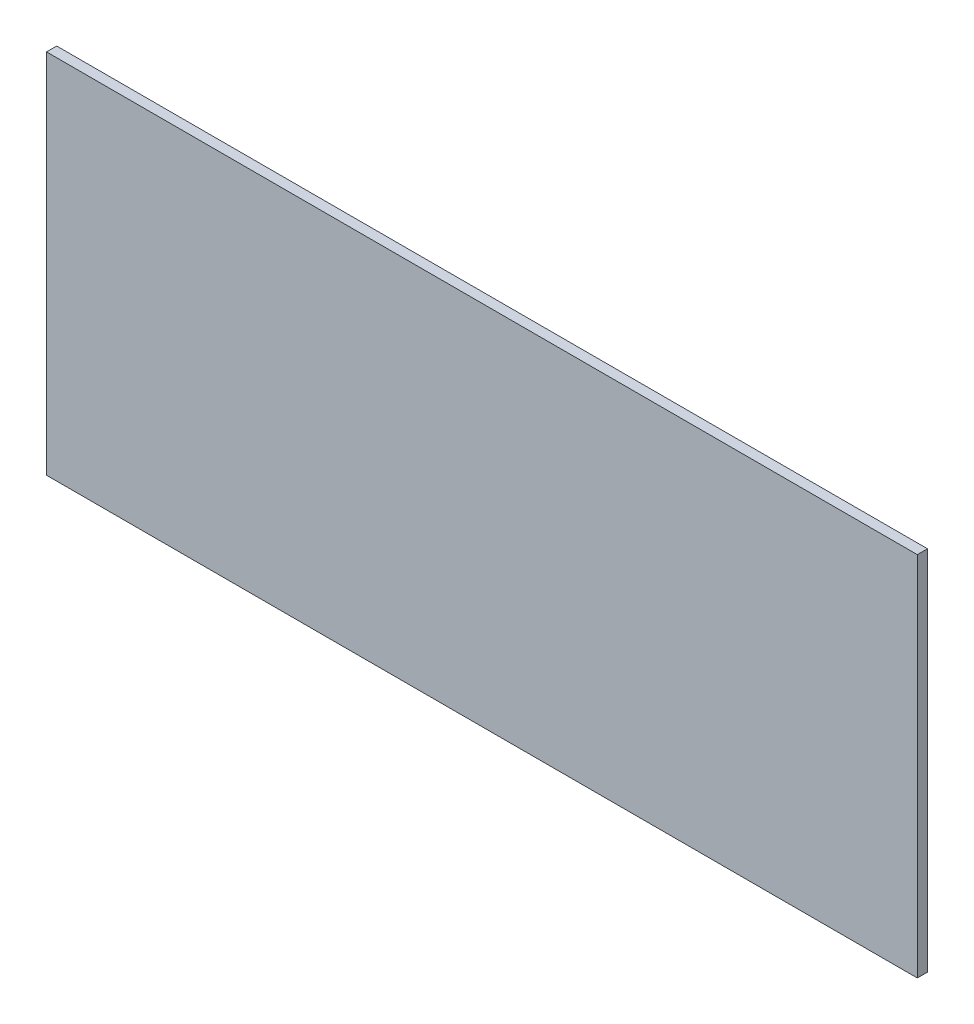
ISO-10303-21;
HEADER;
FILE_DESCRIPTION(('STEP AP214'),'2;1');
FILE_NAME('part.step','',(''),(''),'','','');
FILE_SCHEMA(('AUTOMOTIVE_DESIGN { 1 0 10303 214 1 1 1 1 }'));
ENDSEC;
DATA;
#1=APPLICATION_CONTEXT('core data for automotive mechanical design processes');
#2=APPLICATION_PROTOCOL_DEFINITION('international standard','automotive_design',2000,#1);
#3=PRODUCT_CONTEXT('',#1,'mechanical');
#4=PRODUCT('Part','Part','',(#3));
#5=PRODUCT_RELATED_PRODUCT_CATEGORY('part','',(#4));
#6=PRODUCT_DEFINITION_FORMATION('','',#4);
#7=PRODUCT_DEFINITION_CONTEXT('part definition',#1,'design');
#8=PRODUCT_DEFINITION('design','',#6,#7);
#9=PRODUCT_DEFINITION_SHAPE('','',#8);
#10=(LENGTH_UNIT() NAMED_UNIT(*) SI_UNIT(.MILLI.,.METRE.));
#11=(NAMED_UNIT(*) PLANE_ANGLE_UNIT() SI_UNIT($,.RADIAN.));
#12=(NAMED_UNIT(*) SI_UNIT($,.STERADIAN.) SOLID_ANGLE_UNIT());
#13=UNCERTAINTY_MEASURE_WITH_UNIT(LENGTH_MEASURE(1.E-05),#10,'distance_accuracy_value','');
#14=(GEOMETRIC_REPRESENTATION_CONTEXT(3) GLOBAL_UNCERTAINTY_ASSIGNED_CONTEXT((#13)) GLOBAL_UNIT_ASSIGNED_CONTEXT((#10,
#11,#12)) REPRESENTATION_CONTEXT('',''));
#15=CARTESIAN_POINT('',(0.,0.,0.));
#16=DIRECTION('',(0.,0.,1.));
#17=DIRECTION('',(1.,0.,0.));
#18=AXIS2_PLACEMENT_3D('',#15,#16,#17);
#19=CARTESIAN_POINT('',(87.,-36.,2.));
#20=DIRECTION('',(-1.,0.,0.));
#21=DIRECTION('',(0.,0.,1.));
#22=AXIS2_PLACEMENT_3D('',#19,#20,#21);
#23=PLANE('',#22);
#24=DIRECTION('',(0.,1.,0.));
#25=VECTOR('',#24,1.);
#26=CARTESIAN_POINT('',(87.,-36.,0.));
#27=LINE('',#26,#25);
#28=CARTESIAN_POINT('',(87.,-36.,0.));
#29=VERTEX_POINT('',#28);
#30=CARTESIAN_POINT('',(87.,36.,0.));
#31=VERTEX_POINT('',#30);
#32=EDGE_CURVE('E96',#29,#31,#27,.T.);
#33=ORIENTED_EDGE('',*,*,#32,.T.);
#34=DIRECTION('',(0.,0.,-1.));
#35=VECTOR('',#34,1.);
#36=CARTESIAN_POINT('',(87.,36.,2.));
#37=LINE('',#36,#35);
#38=CARTESIAN_POINT('',(87.,36.,2.));
#39=VERTEX_POINT('',#38);
#40=EDGE_CURVE('E11',#39,#31,#37,.T.);
#41=ORIENTED_EDGE('',*,*,#40,.F.);
#42=DIRECTION('',(0.,1.,0.));
#43=VECTOR('',#42,1.);
#44=CARTESIAN_POINT('',(87.,-36.,2.));
#45=LINE('',#44,#43);
#46=CARTESIAN_POINT('',(87.,-36.,2.));
#47=VERTEX_POINT('',#46);
#48=EDGE_CURVE('E84',#47,#39,#45,.T.);
#49=ORIENTED_EDGE('',*,*,#48,.F.);
#50=DIRECTION('',(0.,0.,-1.));
#51=VECTOR('',#50,1.);
#52=CARTESIAN_POINT('',(87.,-36.,2.));
#53=LINE('',#52,#51);
#54=EDGE_CURVE('E92',#47,#29,#53,.T.);
#55=ORIENTED_EDGE('',*,*,#54,.T.);
#56=EDGE_LOOP('',(#33,#41,#49,#55));
#57=FACE_BOUND('',#56,.T.);
#58=ADVANCED_FACE('F33',(#57),#23,.F.);
#59=CARTESIAN_POINT('',(-84.,36.,2.));
#60=DIRECTION('',(0.,-1.,0.));
#61=DIRECTION('',(0.,0.,-1.));
#62=AXIS2_PLACEMENT_3D('',#59,#60,#61);
#63=PLANE('',#62);
#64=DIRECTION('',(-1.,0.,0.));
#65=VECTOR('',#64,1.);
#66=CARTESIAN_POINT('',(-84.,36.,0.));
#67=LINE('',#66,#65);
#68=CARTESIAN_POINT('',(-84.,36.,0.));
#69=VERTEX_POINT('',#68);
#70=EDGE_CURVE('E88',#31,#69,#67,.T.);
#71=ORIENTED_EDGE('',*,*,#70,.T.);
#72=DIRECTION('',(0.,0.,-1.));
#73=VECTOR('',#72,1.);
#74=CARTESIAN_POINT('',(-84.,36.,2.));
#75=LINE('',#74,#73);
#76=CARTESIAN_POINT('',(-84.,36.,2.));
#77=VERTEX_POINT('',#76);
#78=EDGE_CURVE('E41',#77,#69,#75,.T.);
#79=ORIENTED_EDGE('',*,*,#78,.F.);
#80=DIRECTION('',(-1.,0.,0.));
#81=VECTOR('',#80,1.);
#82=CARTESIAN_POINT('',(-84.,36.,2.));
#83=LINE('',#82,#81);
#84=EDGE_CURVE('E79',#39,#77,#83,.T.);
#85=ORIENTED_EDGE('',*,*,#84,.F.);
#86=ORIENTED_EDGE('',*,*,#40,.T.);
#87=EDGE_LOOP('',(#71,#79,#85,#86));
#88=FACE_BOUND('',#87,.T.);
#89=ADVANCED_FACE('F87',(#88),#63,.F.);
#90=CARTESIAN_POINT('',(-84.,-36.,2.));
#91=DIRECTION('',(1.,0.,0.));
#92=DIRECTION('',(0.,0.,-1.));
#93=AXIS2_PLACEMENT_3D('',#90,#91,#92);
#94=PLANE('',#93);
#95=DIRECTION('',(0.,-1.,0.));
#96=VECTOR('',#95,1.);
#97=CARTESIAN_POINT('',(-84.,-36.,0.));
#98=LINE('',#97,#96);
#99=CARTESIAN_POINT('',(-84.,-36.,0.));
#100=VERTEX_POINT('',#99);
#101=EDGE_CURVE('E66',#69,#100,#98,.T.);
#102=ORIENTED_EDGE('',*,*,#101,.T.);
#103=DIRECTION('',(0.,0.,-1.));
#104=VECTOR('',#103,1.);
#105=CARTESIAN_POINT('',(-84.,-36.,2.));
#106=LINE('',#105,#104);
#107=CARTESIAN_POINT('',(-84.,-36.,2.));
#108=VERTEX_POINT('',#107);
#109=EDGE_CURVE('E89',#108,#100,#106,.T.);
#110=ORIENTED_EDGE('',*,*,#109,.F.);
#111=DIRECTION('',(0.,-1.,0.));
#112=VECTOR('',#111,1.);
#113=CARTESIAN_POINT('',(-84.,-36.,2.));
#114=LINE('',#113,#112);
#115=EDGE_CURVE('E82',#77,#108,#114,.T.);
#116=ORIENTED_EDGE('',*,*,#115,.F.);
#117=ORIENTED_EDGE('',*,*,#78,.T.);
#118=EDGE_LOOP('',(#102,#110,#116,#117));
#119=FACE_BOUND('',#118,.T.);
#120=ADVANCED_FACE('F90',(#119),#94,.F.);
#121=CARTESIAN_POINT('',(-84.,-36.,2.));
#122=DIRECTION('',(0.,1.,0.));
#123=DIRECTION('',(0.,0.,1.));
#124=AXIS2_PLACEMENT_3D('',#121,#122,#123);
#125=PLANE('',#124);
#126=DIRECTION('',(1.,0.,0.));
#127=VECTOR('',#126,1.);
#128=CARTESIAN_POINT('',(-84.,-36.,0.));
#129=LINE('',#128,#127);
#130=EDGE_CURVE('E72',#100,#29,#129,.T.);
#131=ORIENTED_EDGE('',*,*,#130,.T.);
#132=ORIENTED_EDGE('',*,*,#54,.F.);
#133=DIRECTION('',(1.,0.,0.));
#134=VECTOR('',#133,1.);
#135=CARTESIAN_POINT('',(-84.,-36.,2.));
#136=LINE('',#135,#134);
#137=EDGE_CURVE('E49',#108,#47,#136,.T.);
#138=ORIENTED_EDGE('',*,*,#137,.F.);
#139=ORIENTED_EDGE('',*,*,#109,.T.);
#140=EDGE_LOOP('',(#131,#132,#138,#139));
#141=FACE_BOUND('',#140,.T.);
#142=ADVANCED_FACE('F103',(#141),#125,.F.);
#143=CARTESIAN_POINT('',(0.,0.,2.));
#144=DIRECTION('',(0.,0.,-1.));
#145=DIRECTION('',(-1.,0.,0.));
#146=AXIS2_PLACEMENT_3D('',#143,#144,#145);
#147=PLANE('',#146);
#148=ORIENTED_EDGE('',*,*,#48,.T.);
#149=ORIENTED_EDGE('',*,*,#84,.T.);
#150=ORIENTED_EDGE('',*,*,#115,.T.);
#151=ORIENTED_EDGE('',*,*,#137,.T.);
#152=EDGE_LOOP('',(#148,#149,#150,#151));
#153=FACE_BOUND('',#152,.T.);
#154=ADVANCED_FACE('F80',(#153),#147,.F.);
#155=CARTESIAN_POINT('',(0.,0.,0.));
#156=DIRECTION('',(0.,0.,-1.));
#157=DIRECTION('',(-1.,0.,0.));
#158=AXIS2_PLACEMENT_3D('',#155,#156,#157);
#159=PLANE('',#158);
#160=ORIENTED_EDGE('',*,*,#32,.F.);
#161=ORIENTED_EDGE('',*,*,#130,.F.);
#162=ORIENTED_EDGE('',*,*,#101,.F.);
#163=ORIENTED_EDGE('',*,*,#70,.F.);
#164=EDGE_LOOP('',(#160,#161,#162,#163));
#165=FACE_BOUND('',#164,.T.);
#166=ADVANCED_FACE('F106',(#165),#159,.T.);
#167=CLOSED_SHELL('',(#58,#89,#120,#142,#154,#166));
#168=MANIFOLD_SOLID_BREP('B2',#167);
#169=ADVANCED_BREP_SHAPE_REPRESENTATION('',(#18,#168),#14);
#170=SHAPE_DEFINITION_REPRESENTATION(#9,#169);
ENDSEC;
END-ISO-10303-21;
